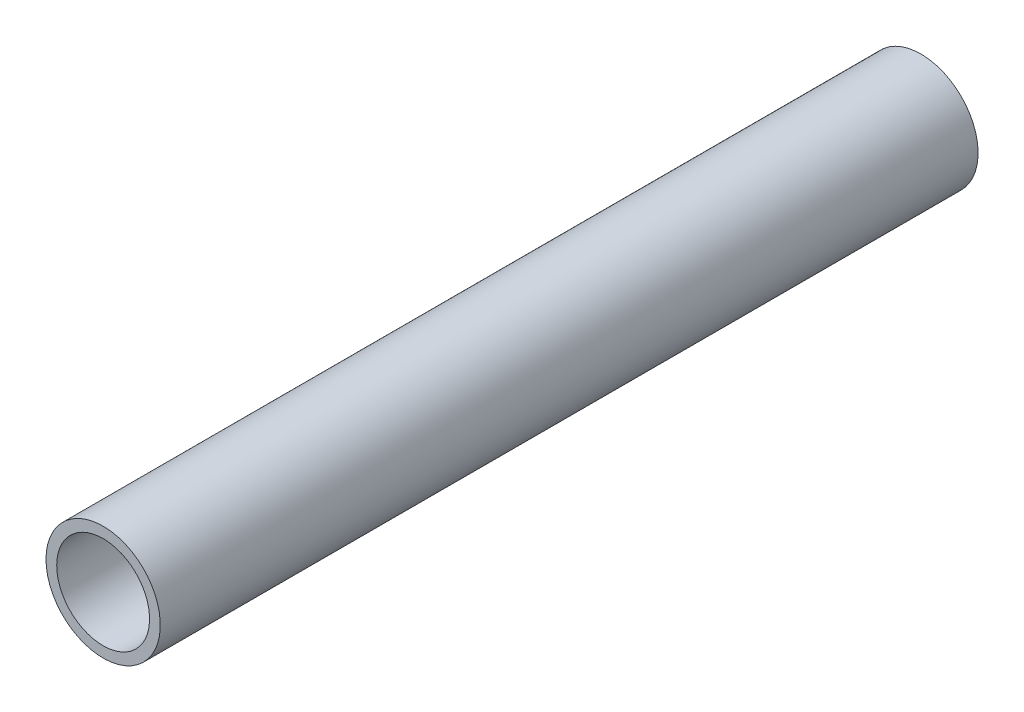
ISO-10303-21;
HEADER;
FILE_DESCRIPTION(('STEP AP214'),'2;1');
FILE_NAME('part.step','',(''),(''),'','','');
FILE_SCHEMA(('AUTOMOTIVE_DESIGN { 1 0 10303 214 1 1 1 1 }'));
ENDSEC;
DATA;
#1=APPLICATION_CONTEXT('core data for automotive mechanical design processes');
#2=APPLICATION_PROTOCOL_DEFINITION('international standard','automotive_design',2000,#1);
#3=PRODUCT_CONTEXT('',#1,'mechanical');
#4=PRODUCT('Part','Part','',(#3));
#5=PRODUCT_RELATED_PRODUCT_CATEGORY('part','',(#4));
#6=PRODUCT_DEFINITION_FORMATION('','',#4);
#7=PRODUCT_DEFINITION_CONTEXT('part definition',#1,'design');
#8=PRODUCT_DEFINITION('design','',#6,#7);
#9=PRODUCT_DEFINITION_SHAPE('','',#8);
#10=(LENGTH_UNIT() NAMED_UNIT(*) SI_UNIT(.MILLI.,.METRE.));
#11=(NAMED_UNIT(*) PLANE_ANGLE_UNIT() SI_UNIT($,.RADIAN.));
#12=(NAMED_UNIT(*) SI_UNIT($,.STERADIAN.) SOLID_ANGLE_UNIT());
#13=UNCERTAINTY_MEASURE_WITH_UNIT(LENGTH_MEASURE(1.E-05),#10,'distance_accuracy_value','');
#14=(GEOMETRIC_REPRESENTATION_CONTEXT(3) GLOBAL_UNCERTAINTY_ASSIGNED_CONTEXT((#13)) GLOBAL_UNIT_ASSIGNED_CONTEXT((#10,
#11,#12)) REPRESENTATION_CONTEXT('',''));
#15=CARTESIAN_POINT('',(0.,0.,0.));
#16=DIRECTION('',(0.,0.,1.));
#17=DIRECTION('',(1.,0.,0.));
#18=AXIS2_PLACEMENT_3D('',#15,#16,#17);
#19=CARTESIAN_POINT('',(0.,0.,114.5));
#20=DIRECTION('',(0.,0.,-1.));
#21=DIRECTION('',(-1.,0.,0.));
#22=AXIS2_PLACEMENT_3D('',#19,#20,#21);
#23=CYLINDRICAL_SURFACE('',#22,16.);
#24=CARTESIAN_POINT('',(0.,0.,114.5));
#25=DIRECTION('',(0.,0.,1.));
#26=DIRECTION('',(1.,0.,0.));
#27=AXIS2_PLACEMENT_3D('',#24,#25,#26);
#28=CIRCLE('',#27,16.);
#29=CARTESIAN_POINT('',(-16.,0.,114.5));
#30=VERTEX_POINT('',#29);
#31=EDGE_CURVE('E10',#30,#30,#28,.T.);
#32=CARTESIAN_POINT('',(0.,0.,-114.5));
#33=DIRECTION('',(0.,0.,1.));
#34=DIRECTION('',(1.,0.,0.));
#35=AXIS2_PLACEMENT_3D('',#32,#33,#34);
#36=CIRCLE('',#35,16.);
#37=CARTESIAN_POINT('',(-16.,0.,-114.5));
#38=VERTEX_POINT('',#37);
#39=EDGE_CURVE('E33',#38,#38,#36,.T.);
#40=CARTESIAN_POINT('',(-16.,0.,114.5));
#41=CARTESIAN_POINT('',(-16.,0.,112.114583333333));
#42=CARTESIAN_POINT('',(-16.,0.,109.729166666667));
#43=CARTESIAN_POINT('',(-16.,0.,104.958333333333));
#44=CARTESIAN_POINT('',(-16.,0.,102.572916666667));
#45=CARTESIAN_POINT('',(-16.,0.,97.8020833333333));
#46=CARTESIAN_POINT('',(-16.,0.,95.4166666666667));
#47=CARTESIAN_POINT('',(-16.,0.,90.6458333333333));
#48=CARTESIAN_POINT('',(-16.,0.,88.2604166666667));
#49=CARTESIAN_POINT('',(-16.,0.,83.4895833333333));
#50=CARTESIAN_POINT('',(-16.,0.,81.1041666666667));
#51=CARTESIAN_POINT('',(-16.,0.,76.3333333333333));
#52=CARTESIAN_POINT('',(-16.,0.,73.9479166666667));
#53=CARTESIAN_POINT('',(-16.,0.,69.1770833333333));
#54=CARTESIAN_POINT('',(-16.,0.,66.7916666666667));
#55=CARTESIAN_POINT('',(-16.,0.,62.0208333333333));
#56=CARTESIAN_POINT('',(-16.,0.,59.6354166666667));
#57=CARTESIAN_POINT('',(-16.,0.,54.8645833333333));
#58=CARTESIAN_POINT('',(-16.,0.,52.4791666666667));
#59=CARTESIAN_POINT('',(-16.,0.,47.7083333333333));
#60=CARTESIAN_POINT('',(-16.,0.,45.3229166666667));
#61=CARTESIAN_POINT('',(-16.,0.,40.5520833333333));
#62=CARTESIAN_POINT('',(-16.,0.,38.1666666666667));
#63=CARTESIAN_POINT('',(-16.,0.,33.3958333333333));
#64=CARTESIAN_POINT('',(-16.,0.,31.0104166666667));
#65=CARTESIAN_POINT('',(-16.,0.,26.2395833333333));
#66=CARTESIAN_POINT('',(-16.,0.,23.8541666666667));
#67=CARTESIAN_POINT('',(-16.,0.,19.0833333333333));
#68=CARTESIAN_POINT('',(-16.,0.,16.6979166666667));
#69=CARTESIAN_POINT('',(-16.,0.,11.9270833333333));
#70=CARTESIAN_POINT('',(-16.,0.,9.54166666666666));
#71=CARTESIAN_POINT('',(-16.,0.,4.77083333333332));
#72=CARTESIAN_POINT('',(-16.,0.,2.38541666666665));
#73=CARTESIAN_POINT('',(-16.,0.,-2.38541666666668));
#74=CARTESIAN_POINT('',(-16.,0.,-4.77083333333335));
#75=CARTESIAN_POINT('',(-16.,0.,-9.54166666666667));
#76=CARTESIAN_POINT('',(-16.,0.,-11.9270833333333));
#77=CARTESIAN_POINT('',(-16.,0.,-16.6979166666667));
#78=CARTESIAN_POINT('',(-16.,0.,-19.0833333333333));
#79=CARTESIAN_POINT('',(-16.,0.,-23.8541666666667));
#80=CARTESIAN_POINT('',(-16.,0.,-26.2395833333333));
#81=CARTESIAN_POINT('',(-16.,0.,-31.0104166666667));
#82=CARTESIAN_POINT('',(-16.,0.,-33.3958333333333));
#83=CARTESIAN_POINT('',(-16.,0.,-38.1666666666667));
#84=CARTESIAN_POINT('',(-16.,0.,-40.5520833333333));
#85=CARTESIAN_POINT('',(-16.,0.,-45.3229166666667));
#86=CARTESIAN_POINT('',(-16.,0.,-47.7083333333333));
#87=CARTESIAN_POINT('',(-16.,0.,-52.4791666666667));
#88=CARTESIAN_POINT('',(-16.,0.,-54.8645833333333));
#89=CARTESIAN_POINT('',(-16.,0.,-59.6354166666667));
#90=CARTESIAN_POINT('',(-16.,0.,-62.0208333333333));
#91=CARTESIAN_POINT('',(-16.,0.,-66.7916666666667));
#92=CARTESIAN_POINT('',(-16.,0.,-69.1770833333333));
#93=CARTESIAN_POINT('',(-16.,0.,-73.9479166666667));
#94=CARTESIAN_POINT('',(-16.,0.,-76.3333333333333));
#95=CARTESIAN_POINT('',(-16.,0.,-81.1041666666667));
#96=CARTESIAN_POINT('',(-16.,0.,-83.4895833333333));
#97=CARTESIAN_POINT('',(-16.,0.,-88.2604166666667));
#98=CARTESIAN_POINT('',(-16.,0.,-90.6458333333333));
#99=CARTESIAN_POINT('',(-16.,0.,-95.4166666666667));
#100=CARTESIAN_POINT('',(-16.,0.,-97.8020833333333));
#101=CARTESIAN_POINT('',(-16.,0.,-102.572916666667));
#102=CARTESIAN_POINT('',(-16.,0.,-104.958333333333));
#103=CARTESIAN_POINT('',(-16.,0.,-109.729166666667));
#104=CARTESIAN_POINT('',(-16.,0.,-112.114583333333));
#105=CARTESIAN_POINT('',(-16.,0.,-114.5));
#106=B_SPLINE_CURVE_WITH_KNOTS('',3,(#40,#41,#42,#43,#44,#45,#46,#47,#48,#49,#50,#51,#52,#53,
#54,#55,#56,#57,#58,#59,#60,#61,#62,#63,#64,#65,#66,#67,#68,#69,#70,#71,#72,#73,#74,#75,#76,#77,
#78,#79,#80,#81,#82,#83,#84,#85,#86,#87,#88,#89,#90,#91,#92,#93,#94,#95,#96,#97,#98,#99,#100,
#101,#102,#103,#104,#105),.UNSPECIFIED.,.F.,.F.,(4,2,2,2,2,2,2,2,2,2,2,2,2,2,2,2,2,2,2,2,2,2,2,
2,2,2,2,2,2,2,2,2,4),(0.,7.15624999999999,14.3125,21.46875,28.625,35.78125,42.9375,50.09375,
57.25,64.40625,71.5625,78.71875,85.875,93.03125,100.1875,107.34375,114.5,121.65625,128.8125,
135.96875,143.125,150.28125,157.4375,164.59375,171.75,178.90625,186.0625,193.21875,200.375,
207.53125,214.6875,221.84375,229.),.UNSPECIFIED.);
#107=EDGE_CURVE('BSEAM30',#30,#38,#106,.T.);
#108=ORIENTED_EDGE('',*,*,#31,.F.);
#109=ORIENTED_EDGE('',*,*,#39,.T.);
#110=ORIENTED_EDGE('',*,*,#107,.T.);
#111=ORIENTED_EDGE('',*,*,#107,.F.);
#112=EDGE_LOOP('',(#108,#110,#109,#111));
#113=FACE_BOUND('',#112,.T.);
#114=ADVANCED_FACE('F30',(#113),#23,.T.);
#115=CARTESIAN_POINT('',(0.,0.,114.5));
#116=DIRECTION('',(0.,0.,1.));
#117=DIRECTION('',(1.,0.,0.));
#118=AXIS2_PLACEMENT_3D('',#115,#116,#117);
#119=PLANE('',#118);
#120=CARTESIAN_POINT('',(0.,0.,114.5));
#121=DIRECTION('',(0.,0.,1.));
#122=DIRECTION('',(1.,0.,0.));
#123=AXIS2_PLACEMENT_3D('',#120,#121,#122);
#124=CIRCLE('',#123,13.);
#125=CARTESIAN_POINT('',(-13.,0.,114.5));
#126=VERTEX_POINT('',#125);
#127=EDGE_CURVE('E40',#126,#126,#124,.T.);
#128=ORIENTED_EDGE('',*,*,#127,.F.);
#129=EDGE_LOOP('',(#128));
#130=FACE_BOUND('',#129,.T.);
#131=ORIENTED_EDGE('',*,*,#31,.T.);
#132=EDGE_LOOP('',(#131));
#133=FACE_BOUND('',#132,.T.);
#134=ADVANCED_FACE('F51',(#130,#133),#119,.T.);
#135=CARTESIAN_POINT('',(0.,0.,-114.5));
#136=DIRECTION('',(0.,0.,1.));
#137=DIRECTION('',(1.,0.,0.));
#138=AXIS2_PLACEMENT_3D('',#135,#136,#137);
#139=PLANE('',#138);
#140=CARTESIAN_POINT('',(0.,0.,-114.5));
#141=DIRECTION('',(0.,0.,1.));
#142=DIRECTION('',(1.,0.,0.));
#143=AXIS2_PLACEMENT_3D('',#140,#141,#142);
#144=CIRCLE('',#143,13.);
#145=CARTESIAN_POINT('',(-13.,0.,-114.5));
#146=VERTEX_POINT('',#145);
#147=EDGE_CURVE('E42',#146,#146,#144,.T.);
#148=ORIENTED_EDGE('',*,*,#147,.T.);
#149=EDGE_LOOP('',(#148));
#150=FACE_BOUND('',#149,.T.);
#151=ORIENTED_EDGE('',*,*,#39,.F.);
#152=EDGE_LOOP('',(#151));
#153=FACE_BOUND('',#152,.T.);
#154=ADVANCED_FACE('F53',(#150,#153),#139,.F.);
#155=CARTESIAN_POINT('',(0.,0.,114.5));
#156=DIRECTION('',(0.,0.,-1.));
#157=DIRECTION('',(-1.,0.,0.));
#158=AXIS2_PLACEMENT_3D('',#155,#156,#157);
#159=CYLINDRICAL_SURFACE('',#158,13.);
#160=CARTESIAN_POINT('',(-13.,0.,114.5));
#161=CARTESIAN_POINT('',(-13.,0.,112.114583333333));
#162=CARTESIAN_POINT('',(-13.,0.,109.729166666667));
#163=CARTESIAN_POINT('',(-13.,0.,104.958333333333));
#164=CARTESIAN_POINT('',(-13.,0.,102.572916666667));
#165=CARTESIAN_POINT('',(-13.,0.,97.8020833333333));
#166=CARTESIAN_POINT('',(-13.,0.,95.4166666666667));
#167=CARTESIAN_POINT('',(-13.,0.,90.6458333333333));
#168=CARTESIAN_POINT('',(-13.,0.,88.2604166666667));
#169=CARTESIAN_POINT('',(-13.,0.,83.4895833333333));
#170=CARTESIAN_POINT('',(-13.,0.,81.1041666666667));
#171=CARTESIAN_POINT('',(-13.,0.,76.3333333333333));
#172=CARTESIAN_POINT('',(-13.,0.,73.9479166666667));
#173=CARTESIAN_POINT('',(-13.,0.,69.1770833333333));
#174=CARTESIAN_POINT('',(-13.,0.,66.7916666666667));
#175=CARTESIAN_POINT('',(-13.,0.,62.0208333333333));
#176=CARTESIAN_POINT('',(-13.,0.,59.6354166666667));
#177=CARTESIAN_POINT('',(-13.,0.,54.8645833333333));
#178=CARTESIAN_POINT('',(-13.,0.,52.4791666666667));
#179=CARTESIAN_POINT('',(-13.,0.,47.7083333333333));
#180=CARTESIAN_POINT('',(-13.,0.,45.3229166666667));
#181=CARTESIAN_POINT('',(-13.,0.,40.5520833333333));
#182=CARTESIAN_POINT('',(-13.,0.,38.1666666666667));
#183=CARTESIAN_POINT('',(-13.,0.,33.3958333333333));
#184=CARTESIAN_POINT('',(-13.,0.,31.0104166666667));
#185=CARTESIAN_POINT('',(-13.,0.,26.2395833333333));
#186=CARTESIAN_POINT('',(-13.,0.,23.8541666666667));
#187=CARTESIAN_POINT('',(-13.,0.,19.0833333333333));
#188=CARTESIAN_POINT('',(-13.,0.,16.6979166666667));
#189=CARTESIAN_POINT('',(-13.,0.,11.9270833333333));
#190=CARTESIAN_POINT('',(-13.,0.,9.54166666666666));
#191=CARTESIAN_POINT('',(-13.,0.,4.77083333333332));
#192=CARTESIAN_POINT('',(-13.,0.,2.38541666666665));
#193=CARTESIAN_POINT('',(-13.,0.,-2.38541666666668));
#194=CARTESIAN_POINT('',(-13.,0.,-4.77083333333335));
#195=CARTESIAN_POINT('',(-13.,0.,-9.54166666666667));
#196=CARTESIAN_POINT('',(-13.,0.,-11.9270833333333));
#197=CARTESIAN_POINT('',(-13.,0.,-16.6979166666667));
#198=CARTESIAN_POINT('',(-13.,0.,-19.0833333333333));
#199=CARTESIAN_POINT('',(-13.,0.,-23.8541666666667));
#200=CARTESIAN_POINT('',(-13.,0.,-26.2395833333333));
#201=CARTESIAN_POINT('',(-13.,0.,-31.0104166666667));
#202=CARTESIAN_POINT('',(-13.,0.,-33.3958333333333));
#203=CARTESIAN_POINT('',(-13.,0.,-38.1666666666667));
#204=CARTESIAN_POINT('',(-13.,0.,-40.5520833333333));
#205=CARTESIAN_POINT('',(-13.,0.,-45.3229166666667));
#206=CARTESIAN_POINT('',(-13.,0.,-47.7083333333333));
#207=CARTESIAN_POINT('',(-13.,0.,-52.4791666666667));
#208=CARTESIAN_POINT('',(-13.,0.,-54.8645833333333));
#209=CARTESIAN_POINT('',(-13.,0.,-59.6354166666667));
#210=CARTESIAN_POINT('',(-13.,0.,-62.0208333333333));
#211=CARTESIAN_POINT('',(-13.,0.,-66.7916666666667));
#212=CARTESIAN_POINT('',(-13.,0.,-69.1770833333333));
#213=CARTESIAN_POINT('',(-13.,0.,-73.9479166666667));
#214=CARTESIAN_POINT('',(-13.,0.,-76.3333333333333));
#215=CARTESIAN_POINT('',(-13.,0.,-81.1041666666667));
#216=CARTESIAN_POINT('',(-13.,0.,-83.4895833333333));
#217=CARTESIAN_POINT('',(-13.,0.,-88.2604166666667));
#218=CARTESIAN_POINT('',(-13.,0.,-90.6458333333333));
#219=CARTESIAN_POINT('',(-13.,0.,-95.4166666666667));
#220=CARTESIAN_POINT('',(-13.,0.,-97.8020833333333));
#221=CARTESIAN_POINT('',(-13.,0.,-102.572916666667));
#222=CARTESIAN_POINT('',(-13.,0.,-104.958333333333));
#223=CARTESIAN_POINT('',(-13.,0.,-109.729166666667));
#224=CARTESIAN_POINT('',(-13.,0.,-112.114583333333));
#225=CARTESIAN_POINT('',(-13.,0.,-114.5));
#226=B_SPLINE_CURVE_WITH_KNOTS('',3,(#160,#161,#162,#163,#164,#165,#166,#167,#168,#169,#170,
#171,#172,#173,#174,#175,#176,#177,#178,#179,#180,#181,#182,#183,#184,#185,#186,#187,#188,#189,
#190,#191,#192,#193,#194,#195,#196,#197,#198,#199,#200,#201,#202,#203,#204,#205,#206,#207,#208,
#209,#210,#211,#212,#213,#214,#215,#216,#217,#218,#219,#220,#221,#222,#223,#224,#225),
.UNSPECIFIED.,.F.,.F.,(4,2,2,2,2,2,2,2,2,2,2,2,2,2,2,2,2,2,2,2,2,2,2,2,2,2,2,2,2,2,2,2,4),(0.,
7.15624999999999,14.3125,21.46875,28.625,35.78125,42.9375,50.09375,57.25,64.40625,71.5625,
78.71875,85.875,93.03125,100.1875,107.34375,114.5,121.65625,128.8125,135.96875,143.125,
150.28125,157.4375,164.59375,171.75,178.90625,186.0625,193.21875,200.375,207.53125,214.6875,
221.84375,229.),.UNSPECIFIED.);
#227=EDGE_CURVE('BSEAM48',#126,#146,#226,.T.);
#228=ORIENTED_EDGE('',*,*,#127,.T.);
#229=ORIENTED_EDGE('',*,*,#147,.F.);
#230=ORIENTED_EDGE('',*,*,#227,.T.);
#231=ORIENTED_EDGE('',*,*,#227,.F.);
#232=EDGE_LOOP('',(#228,#230,#229,#231));
#233=FACE_BOUND('',#232,.T.);
#234=ADVANCED_FACE('F48',(#233),#159,.F.);
#235=CLOSED_SHELL('',(#114,#134,#154,#234));
#236=MANIFOLD_SOLID_BREP('B2',#235);
#237=ADVANCED_BREP_SHAPE_REPRESENTATION('',(#18,#236),#14);
#238=SHAPE_DEFINITION_REPRESENTATION(#9,#237);
ENDSEC;
END-ISO-10303-21;
